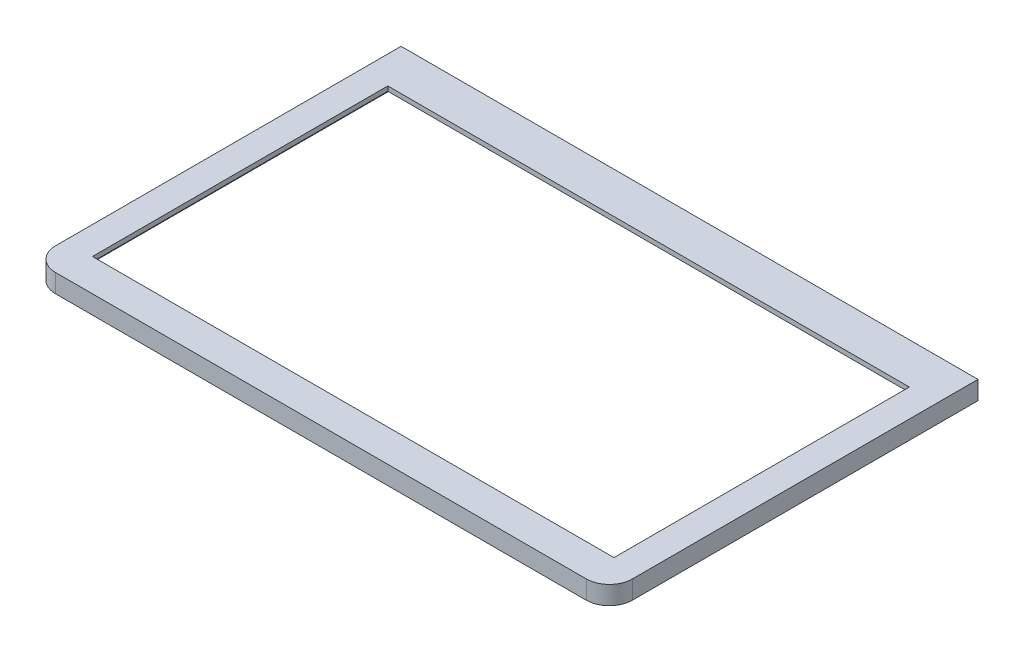
ISO-10303-21;
HEADER;
FILE_DESCRIPTION(('STEP AP214'),'2;1');
FILE_NAME('part.step','',(''),(''),'','','');
FILE_SCHEMA(('AUTOMOTIVE_DESIGN { 1 0 10303 214 1 1 1 1 }'));
ENDSEC;
DATA;
#1=APPLICATION_CONTEXT('core data for automotive mechanical design processes');
#2=APPLICATION_PROTOCOL_DEFINITION('international standard','automotive_design',2000,#1);
#3=PRODUCT_CONTEXT('',#1,'mechanical');
#4=PRODUCT('Part','Part','',(#3));
#5=PRODUCT_RELATED_PRODUCT_CATEGORY('part','',(#4));
#6=PRODUCT_DEFINITION_FORMATION('','',#4);
#7=PRODUCT_DEFINITION_CONTEXT('part definition',#1,'design');
#8=PRODUCT_DEFINITION('design','',#6,#7);
#9=PRODUCT_DEFINITION_SHAPE('','',#8);
#10=(LENGTH_UNIT() NAMED_UNIT(*) SI_UNIT(.MILLI.,.METRE.));
#11=(NAMED_UNIT(*) PLANE_ANGLE_UNIT() SI_UNIT($,.RADIAN.));
#12=(NAMED_UNIT(*) SI_UNIT($,.STERADIAN.) SOLID_ANGLE_UNIT());
#13=UNCERTAINTY_MEASURE_WITH_UNIT(LENGTH_MEASURE(1.E-05),#10,'distance_accuracy_value','');
#14=(GEOMETRIC_REPRESENTATION_CONTEXT(3) GLOBAL_UNCERTAINTY_ASSIGNED_CONTEXT((#13)) GLOBAL_UNIT_ASSIGNED_CONTEXT((#10,
#11,#12)) REPRESENTATION_CONTEXT('',''));
#15=CARTESIAN_POINT('',(0.,0.,0.));
#16=DIRECTION('',(0.,0.,1.));
#17=DIRECTION('',(1.,0.,0.));
#18=AXIS2_PLACEMENT_3D('',#15,#16,#17);
#19=CARTESIAN_POINT('',(0.,8.,0.));
#20=DIRECTION('',(0.,1.,0.));
#21=DIRECTION('',(0.,0.,1.));
#22=AXIS2_PLACEMENT_3D('',#19,#20,#21);
#23=PLANE('',#22);
#24=DIRECTION('',(1.,0.,0.));
#25=VECTOR('',#24,1.);
#26=CARTESIAN_POINT('',(-87.3406720741599,8.,78.8980301274625));
#27=LINE('',#26,#25);
#28=CARTESIAN_POINT('',(-87.3406720741599,8.,78.8980301274625));
#29=VERTEX_POINT('',#28);
#30=CARTESIAN_POINT('',(138.65932792584,8.,78.8980301274625));
#31=VERTEX_POINT('',#30);
#32=EDGE_CURVE('E209',#29,#31,#27,.T.);
#33=ORIENTED_EDGE('',*,*,#32,.F.);
#34=DIRECTION('',(0.,0.,1.));
#35=VECTOR('',#34,1.);
#36=CARTESIAN_POINT('',(-87.3406720741599,8.,-49.1019698725375));
#37=LINE('',#36,#35);
#38=CARTESIAN_POINT('',(-87.3406720741599,8.,-49.1019698725375));
#39=VERTEX_POINT('',#38);
#40=EDGE_CURVE('E212',#39,#29,#37,.T.);
#41=ORIENTED_EDGE('',*,*,#40,.F.);
#42=DIRECTION('',(-1.,0.,0.));
#43=VECTOR('',#42,1.);
#44=CARTESIAN_POINT('',(-87.3406720741599,8.,-49.1019698725375));
#45=LINE('',#44,#43);
#46=CARTESIAN_POINT('',(138.65932792584,8.,-49.1019698725375));
#47=VERTEX_POINT('',#46);
#48=EDGE_CURVE('E202',#47,#39,#45,.T.);
#49=ORIENTED_EDGE('',*,*,#48,.F.);
#50=DIRECTION('',(0.,0.,-1.));
#51=VECTOR('',#50,1.);
#52=CARTESIAN_POINT('',(138.65932792584,8.,-49.1019698725375));
#53=LINE('',#52,#51);
#54=EDGE_CURVE('E205',#31,#47,#53,.T.);
#55=ORIENTED_EDGE('',*,*,#54,.F.);
#56=EDGE_LOOP('',(#33,#41,#49,#55));
#57=FACE_BOUND('',#56,.T.);
#58=CARTESIAN_POINT('',(140.65932792584,8.,82.8980301274625));
#59=DIRECTION('',(0.,-1.,0.));
#60=DIRECTION('',(0.,0.,-1.));
#61=AXIS2_PLACEMENT_3D('',#58,#59,#60);
#62=CIRCLE('',#61,10.);
#63=CARTESIAN_POINT('',(150.65932792584,8.,82.8980301274624));
#64=VERTEX_POINT('',#63);
#65=CARTESIAN_POINT('',(140.65932792584,8.,92.8980301274625));
#66=VERTEX_POINT('',#65);
#67=EDGE_CURVE('E139',#64,#66,#62,.T.);
#68=ORIENTED_EDGE('',*,*,#67,.F.);
#69=DIRECTION('',(0.,0.,-1.));
#70=VECTOR('',#69,1.);
#71=CARTESIAN_POINT('',(150.65932792584,8.,-63.1019698725375));
#72=LINE('',#71,#70);
#73=CARTESIAN_POINT('',(150.65932792584,8.,-66.8519698725375));
#74=VERTEX_POINT('',#73);
#75=EDGE_CURVE('E149',#64,#74,#72,.T.);
#76=ORIENTED_EDGE('',*,*,#75,.T.);
#77=DIRECTION('',(1.,0.,0.));
#78=VECTOR('',#77,1.);
#79=CARTESIAN_POINT('',(150.65932792584,8.,-66.8519698725375));
#80=LINE('',#79,#78);
#81=CARTESIAN_POINT('',(-99.3406720741599,8.,-66.8519698725375));
#82=VERTEX_POINT('',#81);
#83=EDGE_CURVE('E257',#82,#74,#80,.T.);
#84=ORIENTED_EDGE('',*,*,#83,.F.);
#85=DIRECTION('',(0.,0.,1.));
#86=VECTOR('',#85,1.);
#87=CARTESIAN_POINT('',(-99.3406720741599,8.,-63.1019698725375));
#88=LINE('',#87,#86);
#89=CARTESIAN_POINT('',(-99.3406720741599,8.,82.8980301274624));
#90=VERTEX_POINT('',#89);
#91=EDGE_CURVE('E168',#82,#90,#88,.T.);
#92=ORIENTED_EDGE('',*,*,#91,.T.);
#93=CARTESIAN_POINT('',(-89.3406720741599,8.,82.8980301274625));
#94=DIRECTION('',(0.,-1.,0.));
#95=DIRECTION('',(0.,0.,-1.));
#96=AXIS2_PLACEMENT_3D('',#93,#94,#95);
#97=CIRCLE('',#96,9.99999999999999);
#98=CARTESIAN_POINT('',(-89.3406720741599,8.,92.8980301274625));
#99=VERTEX_POINT('',#98);
#100=EDGE_CURVE('E291',#99,#90,#97,.T.);
#101=ORIENTED_EDGE('',*,*,#100,.F.);
#102=DIRECTION('',(1.,0.,0.));
#103=VECTOR('',#102,1.);
#104=CARTESIAN_POINT('',(-99.3406720741599,8.,92.8980301274625));
#105=LINE('',#104,#103);
#106=EDGE_CURVE('E153',#99,#66,#105,.T.);
#107=ORIENTED_EDGE('',*,*,#106,.T.);
#108=EDGE_LOOP('',(#68,#76,#84,#92,#101,#107));
#109=FACE_BOUND('',#108,.T.);
#110=ADVANCED_FACE('F39',(#57,#109),#23,.T.);
#111=CARTESIAN_POINT('',(0.,0.,0.));
#112=DIRECTION('',(0.,1.,0.));
#113=DIRECTION('',(0.,0.,1.));
#114=AXIS2_PLACEMENT_3D('',#111,#112,#113);
#115=PLANE('',#114);
#116=DIRECTION('',(1.,0.,0.));
#117=VECTOR('',#116,1.);
#118=CARTESIAN_POINT('',(-93.0906720741599,0.,-56.8519698725375));
#119=LINE('',#118,#117);
#120=CARTESIAN_POINT('',(-93.0906720741599,0.,-56.8519698725375));
#121=VERTEX_POINT('',#120);
#122=CARTESIAN_POINT('',(142.40932792584,0.,-56.8519698725375));
#123=VERTEX_POINT('',#122);
#124=EDGE_CURVE('E250',#121,#123,#119,.T.);
#125=ORIENTED_EDGE('',*,*,#124,.F.);
#126=DIRECTION('',(0.,0.,-1.));
#127=VECTOR('',#126,1.);
#128=CARTESIAN_POINT('',(-93.0906720741599,0.,82.6480301274625));
#129=LINE('',#128,#127);
#130=CARTESIAN_POINT('',(-93.0906720741599,0.,82.6480301274625));
#131=VERTEX_POINT('',#130);
#132=EDGE_CURVE('E254',#131,#121,#129,.T.);
#133=ORIENTED_EDGE('',*,*,#132,.F.);
#134=DIRECTION('',(-1.,0.,0.));
#135=VECTOR('',#134,1.);
#136=CARTESIAN_POINT('',(-93.0906720741599,0.,82.6480301274625));
#137=LINE('',#136,#135);
#138=CARTESIAN_POINT('',(142.40932792584,0.,82.6480301274625));
#139=VERTEX_POINT('',#138);
#140=EDGE_CURVE('E241',#139,#131,#137,.T.);
#141=ORIENTED_EDGE('',*,*,#140,.F.);
#142=DIRECTION('',(0.,0.,1.));
#143=VECTOR('',#142,1.);
#144=CARTESIAN_POINT('',(142.40932792584,0.,82.6480301274625));
#145=LINE('',#144,#143);
#146=EDGE_CURVE('E246',#123,#139,#145,.T.);
#147=ORIENTED_EDGE('',*,*,#146,.F.);
#148=EDGE_LOOP('',(#125,#133,#141,#147));
#149=FACE_BOUND('',#148,.T.);
#150=DIRECTION('',(0.,0.,-1.));
#151=VECTOR('',#150,1.);
#152=CARTESIAN_POINT('',(150.65932792584,0.,-63.1019698725375));
#153=LINE('',#152,#151);
#154=CARTESIAN_POINT('',(150.65932792584,0.,82.8980301274625));
#155=VERTEX_POINT('',#154);
#156=CARTESIAN_POINT('',(150.65932792584,0.,-66.8519698725375));
#157=VERTEX_POINT('',#156);
#158=EDGE_CURVE('E181',#155,#157,#153,.T.);
#159=ORIENTED_EDGE('',*,*,#158,.F.);
#160=CARTESIAN_POINT('',(140.65932792584,0.,82.8980301274625));
#161=DIRECTION('',(0.,1.,0.));
#162=DIRECTION('',(0.,0.,1.));
#163=AXIS2_PLACEMENT_3D('',#160,#161,#162);
#164=CIRCLE('',#163,10.);
#165=CARTESIAN_POINT('',(140.65932792584,0.,92.8980301274625));
#166=VERTEX_POINT('',#165);
#167=EDGE_CURVE('E62',#155,#166,#164,.F.);
#168=ORIENTED_EDGE('',*,*,#167,.T.);
#169=DIRECTION('',(1.,0.,0.));
#170=VECTOR('',#169,1.);
#171=CARTESIAN_POINT('',(-99.3406720741599,0.,92.8980301274625));
#172=LINE('',#171,#170);
#173=CARTESIAN_POINT('',(-89.3406720741599,0.,92.8980301274625));
#174=VERTEX_POINT('',#173);
#175=EDGE_CURVE('E176',#174,#166,#172,.T.);
#176=ORIENTED_EDGE('',*,*,#175,.F.);
#177=CARTESIAN_POINT('',(-89.3406720741599,0.,82.8980301274625));
#178=DIRECTION('',(0.,1.,0.));
#179=DIRECTION('',(0.,0.,1.));
#180=AXIS2_PLACEMENT_3D('',#177,#178,#179);
#181=CIRCLE('',#180,9.99999999999999);
#182=CARTESIAN_POINT('',(-99.3406720741599,0.,82.8980301274624));
#183=VERTEX_POINT('',#182);
#184=EDGE_CURVE('E55',#174,#183,#181,.F.);
#185=ORIENTED_EDGE('',*,*,#184,.T.);
#186=DIRECTION('',(0.,0.,1.));
#187=VECTOR('',#186,1.);
#188=CARTESIAN_POINT('',(-99.3406720741599,0.,-63.1019698725375));
#189=LINE('',#188,#187);
#190=CARTESIAN_POINT('',(-99.3406720741599,0.,-66.8519698725375));
#191=VERTEX_POINT('',#190);
#192=EDGE_CURVE('E172',#191,#183,#189,.T.);
#193=ORIENTED_EDGE('',*,*,#192,.F.);
#194=DIRECTION('',(-1.,0.,0.));
#195=VECTOR('',#194,1.);
#196=CARTESIAN_POINT('',(150.65932792584,0.,-66.8519698725375));
#197=LINE('',#196,#195);
#198=EDGE_CURVE('E278',#157,#191,#197,.T.);
#199=ORIENTED_EDGE('',*,*,#198,.F.);
#200=EDGE_LOOP('',(#159,#168,#176,#185,#193,#199));
#201=FACE_BOUND('',#200,.T.);
#202=ADVANCED_FACE('F299',(#149,#201),#115,.F.);
#203=CARTESIAN_POINT('',(-99.3406720741599,8.,-63.1019698725375));
#204=DIRECTION('',(1.,0.,0.));
#205=DIRECTION('',(0.,0.,-1.));
#206=AXIS2_PLACEMENT_3D('',#203,#204,#205);
#207=PLANE('',#206);
#208=DIRECTION('',(0.,1.,0.));
#209=VECTOR('',#208,1.);
#210=CARTESIAN_POINT('',(-99.3406720741599,-2.,82.8980301274624));
#211=LINE('',#210,#209);
#212=EDGE_CURVE('E156',#183,#90,#211,.T.);
#213=ORIENTED_EDGE('',*,*,#212,.T.);
#214=ORIENTED_EDGE('',*,*,#91,.F.);
#215=DIRECTION('',(0.,1.,0.));
#216=VECTOR('',#215,1.);
#217=CARTESIAN_POINT('',(-99.3406720741599,8.,-66.8519698725375));
#218=LINE('',#217,#216);
#219=EDGE_CURVE('E274',#191,#82,#218,.T.);
#220=ORIENTED_EDGE('',*,*,#219,.F.);
#221=ORIENTED_EDGE('',*,*,#192,.T.);
#222=EDGE_LOOP('',(#213,#214,#220,#221));
#223=FACE_BOUND('',#222,.T.);
#224=ADVANCED_FACE('F41',(#223),#207,.F.);
#225=CARTESIAN_POINT('',(-99.3406720741599,8.,92.8980301274625));
#226=DIRECTION('',(0.,0.,-1.));
#227=DIRECTION('',(-1.,0.,0.));
#228=AXIS2_PLACEMENT_3D('',#225,#226,#227);
#229=PLANE('',#228);
#230=DIRECTION('',(0.,1.,0.));
#231=VECTOR('',#230,1.);
#232=CARTESIAN_POINT('',(140.65932792584,-2.,92.8980301274625));
#233=LINE('',#232,#231);
#234=EDGE_CURVE('E155',#166,#66,#233,.T.);
#235=ORIENTED_EDGE('',*,*,#234,.T.);
#236=ORIENTED_EDGE('',*,*,#106,.F.);
#237=DIRECTION('',(0.,1.,0.));
#238=VECTOR('',#237,1.);
#239=CARTESIAN_POINT('',(-89.3406720741599,-2.,92.8980301274625));
#240=LINE('',#239,#238);
#241=EDGE_CURVE('E11',#99,#174,#240,.F.);
#242=ORIENTED_EDGE('',*,*,#241,.T.);
#243=ORIENTED_EDGE('',*,*,#175,.T.);
#244=EDGE_LOOP('',(#235,#236,#242,#243));
#245=FACE_BOUND('',#244,.T.);
#246=ADVANCED_FACE('F296',(#245),#229,.F.);
#247=CARTESIAN_POINT('',(-87.3406720741599,8.,-49.1019698725375));
#248=DIRECTION('',(1.,0.,0.));
#249=DIRECTION('',(0.,0.,-1.));
#250=AXIS2_PLACEMENT_3D('',#247,#248,#249);
#251=PLANE('',#250);
#252=DIRECTION('',(0.,-1.,0.));
#253=VECTOR('',#252,1.);
#254=CARTESIAN_POINT('',(-87.3406720741599,8.,78.8980301274625));
#255=LINE('',#254,#253);
#256=CARTESIAN_POINT('',(-87.3406720741599,6.,78.8980301274625));
#257=VERTEX_POINT('',#256);
#258=EDGE_CURVE('E177',#29,#257,#255,.T.);
#259=ORIENTED_EDGE('',*,*,#258,.T.);
#260=DIRECTION('',(0.,0.,-1.));
#261=VECTOR('',#260,1.);
#262=CARTESIAN_POINT('',(-87.3406720741599,6.,-49.1019698725375));
#263=LINE('',#262,#261);
#264=CARTESIAN_POINT('',(-87.3406720741599,6.,-49.1019698725375));
#265=VERTEX_POINT('',#264);
#266=EDGE_CURVE('E215',#257,#265,#263,.T.);
#267=ORIENTED_EDGE('',*,*,#266,.T.);
#268=DIRECTION('',(0.,-1.,0.));
#269=VECTOR('',#268,1.);
#270=CARTESIAN_POINT('',(-87.3406720741599,8.,-49.1019698725375));
#271=LINE('',#270,#269);
#272=EDGE_CURVE('E198',#39,#265,#271,.T.);
#273=ORIENTED_EDGE('',*,*,#272,.F.);
#274=ORIENTED_EDGE('',*,*,#40,.T.);
#275=EDGE_LOOP('',(#259,#267,#273,#274));
#276=FACE_BOUND('',#275,.T.);
#277=ADVANCED_FACE('F322',(#276),#251,.T.);
#278=CARTESIAN_POINT('',(-87.3406720741599,8.,78.8980301274625));
#279=DIRECTION('',(0.,0.,-1.));
#280=DIRECTION('',(-1.,0.,0.));
#281=AXIS2_PLACEMENT_3D('',#278,#279,#280);
#282=PLANE('',#281);
#283=DIRECTION('',(0.,-1.,0.));
#284=VECTOR('',#283,1.);
#285=CARTESIAN_POINT('',(138.65932792584,8.,78.8980301274625));
#286=LINE('',#285,#284);
#287=CARTESIAN_POINT('',(138.65932792584,6.,78.8980301274625));
#288=VERTEX_POINT('',#287);
#289=EDGE_CURVE('E190',#31,#288,#286,.T.);
#290=ORIENTED_EDGE('',*,*,#289,.T.);
#291=DIRECTION('',(-1.,0.,0.));
#292=VECTOR('',#291,1.);
#293=CARTESIAN_POINT('',(-87.3406720741599,6.,78.8980301274625));
#294=LINE('',#293,#292);
#295=EDGE_CURVE('E219',#288,#257,#294,.T.);
#296=ORIENTED_EDGE('',*,*,#295,.T.);
#297=ORIENTED_EDGE('',*,*,#258,.F.);
#298=ORIENTED_EDGE('',*,*,#32,.T.);
#299=EDGE_LOOP('',(#290,#296,#297,#298));
#300=FACE_BOUND('',#299,.T.);
#301=ADVANCED_FACE('F333',(#300),#282,.T.);
#302=CARTESIAN_POINT('',(138.65932792584,8.,-49.1019698725375));
#303=DIRECTION('',(-1.,0.,0.));
#304=DIRECTION('',(0.,0.,1.));
#305=AXIS2_PLACEMENT_3D('',#302,#303,#304);
#306=PLANE('',#305);
#307=DIRECTION('',(0.,-1.,0.));
#308=VECTOR('',#307,1.);
#309=CARTESIAN_POINT('',(138.65932792584,8.,-49.1019698725375));
#310=LINE('',#309,#308);
#311=CARTESIAN_POINT('',(138.65932792584,6.,-49.1019698725375));
#312=VERTEX_POINT('',#311);
#313=EDGE_CURVE('E194',#47,#312,#310,.T.);
#314=ORIENTED_EDGE('',*,*,#313,.T.);
#315=DIRECTION('',(0.,0.,1.));
#316=VECTOR('',#315,1.);
#317=CARTESIAN_POINT('',(138.65932792584,6.,-49.1019698725375));
#318=LINE('',#317,#316);
#319=EDGE_CURVE('E223',#312,#288,#318,.T.);
#320=ORIENTED_EDGE('',*,*,#319,.T.);
#321=ORIENTED_EDGE('',*,*,#289,.F.);
#322=ORIENTED_EDGE('',*,*,#54,.T.);
#323=EDGE_LOOP('',(#314,#320,#321,#322));
#324=FACE_BOUND('',#323,.T.);
#325=ADVANCED_FACE('F416',(#324),#306,.T.);
#326=CARTESIAN_POINT('',(-87.3406720741599,8.,-49.1019698725375));
#327=DIRECTION('',(0.,0.,1.));
#328=DIRECTION('',(1.,0.,0.));
#329=AXIS2_PLACEMENT_3D('',#326,#327,#328);
#330=PLANE('',#329);
#331=ORIENTED_EDGE('',*,*,#272,.T.);
#332=DIRECTION('',(1.,0.,0.));
#333=VECTOR('',#332,1.);
#334=CARTESIAN_POINT('',(-87.3406720741599,6.,-49.1019698725375));
#335=LINE('',#334,#333);
#336=EDGE_CURVE('E145',#265,#312,#335,.T.);
#337=ORIENTED_EDGE('',*,*,#336,.T.);
#338=ORIENTED_EDGE('',*,*,#313,.F.);
#339=ORIENTED_EDGE('',*,*,#48,.T.);
#340=EDGE_LOOP('',(#331,#337,#338,#339));
#341=FACE_BOUND('',#340,.T.);
#342=ADVANCED_FACE('F327',(#341),#330,.T.);
#343=CARTESIAN_POINT('',(150.65932792584,8.,-63.1019698725375));
#344=DIRECTION('',(-1.,0.,0.));
#345=DIRECTION('',(0.,0.,1.));
#346=AXIS2_PLACEMENT_3D('',#343,#344,#345);
#347=PLANE('',#346);
#348=ORIENTED_EDGE('',*,*,#75,.F.);
#349=DIRECTION('',(0.,1.,0.));
#350=VECTOR('',#349,1.);
#351=CARTESIAN_POINT('',(150.65932792584,-2.,82.8980301274625));
#352=LINE('',#351,#350);
#353=EDGE_CURVE('E48',#64,#155,#352,.F.);
#354=ORIENTED_EDGE('',*,*,#353,.T.);
#355=ORIENTED_EDGE('',*,*,#158,.T.);
#356=DIRECTION('',(0.,-1.,0.));
#357=VECTOR('',#356,1.);
#358=CARTESIAN_POINT('',(150.65932792584,8.,-66.8519698725375));
#359=LINE('',#358,#357);
#360=EDGE_CURVE('E161',#74,#157,#359,.T.);
#361=ORIENTED_EDGE('',*,*,#360,.F.);
#362=EDGE_LOOP('',(#348,#354,#355,#361));
#363=FACE_BOUND('',#362,.T.);
#364=ADVANCED_FACE('F159',(#363),#347,.F.);
#365=CARTESIAN_POINT('',(-93.0906720741599,6.,82.6480301274625));
#366=DIRECTION('',(-1.,0.,0.));
#367=DIRECTION('',(0.,0.,1.));
#368=AXIS2_PLACEMENT_3D('',#365,#366,#367);
#369=PLANE('',#368);
#370=ORIENTED_EDGE('',*,*,#132,.T.);
#371=DIRECTION('',(0.,-1.,0.));
#372=VECTOR('',#371,1.);
#373=CARTESIAN_POINT('',(-93.0906720741599,6.,-56.8519698725375));
#374=LINE('',#373,#372);
#375=CARTESIAN_POINT('',(-93.0906720741599,6.,-56.8519698725375));
#376=VERTEX_POINT('',#375);
#377=EDGE_CURVE('E228',#376,#121,#374,.T.);
#378=ORIENTED_EDGE('',*,*,#377,.F.);
#379=DIRECTION('',(0.,0.,-1.));
#380=VECTOR('',#379,1.);
#381=CARTESIAN_POINT('',(-93.0906720741599,6.,82.6480301274625));
#382=LINE('',#381,#380);
#383=CARTESIAN_POINT('',(-93.0906720741599,6.,82.6480301274625));
#384=VERTEX_POINT('',#383);
#385=EDGE_CURVE('E245',#384,#376,#382,.T.);
#386=ORIENTED_EDGE('',*,*,#385,.F.);
#387=DIRECTION('',(0.,-1.,0.));
#388=VECTOR('',#387,1.);
#389=CARTESIAN_POINT('',(-93.0906720741599,6.,82.6480301274625));
#390=LINE('',#389,#388);
#391=EDGE_CURVE('E227',#384,#131,#390,.T.);
#392=ORIENTED_EDGE('',*,*,#391,.T.);
#393=EDGE_LOOP('',(#370,#378,#386,#392));
#394=FACE_BOUND('',#393,.T.);
#395=ADVANCED_FACE('F326',(#394),#369,.F.);
#396=CARTESIAN_POINT('',(-93.0906720741599,6.,82.6480301274625));
#397=DIRECTION('',(0.,0.,1.));
#398=DIRECTION('',(1.,0.,0.));
#399=AXIS2_PLACEMENT_3D('',#396,#397,#398);
#400=PLANE('',#399);
#401=ORIENTED_EDGE('',*,*,#140,.T.);
#402=ORIENTED_EDGE('',*,*,#391,.F.);
#403=DIRECTION('',(-1.,0.,0.));
#404=VECTOR('',#403,1.);
#405=CARTESIAN_POINT('',(-93.0906720741599,6.,82.6480301274625));
#406=LINE('',#405,#404);
#407=CARTESIAN_POINT('',(142.40932792584,6.,82.6480301274625));
#408=VERTEX_POINT('',#407);
#409=EDGE_CURVE('E233',#408,#384,#406,.T.);
#410=ORIENTED_EDGE('',*,*,#409,.F.);
#411=DIRECTION('',(0.,-1.,0.));
#412=VECTOR('',#411,1.);
#413=CARTESIAN_POINT('',(142.40932792584,6.,82.6480301274625));
#414=LINE('',#413,#412);
#415=EDGE_CURVE('E236',#408,#139,#414,.T.);
#416=ORIENTED_EDGE('',*,*,#415,.T.);
#417=EDGE_LOOP('',(#401,#402,#410,#416));
#418=FACE_BOUND('',#417,.T.);
#419=ADVANCED_FACE('F387',(#418),#400,.F.);
#420=CARTESIAN_POINT('',(142.40932792584,6.,82.6480301274625));
#421=DIRECTION('',(1.,0.,0.));
#422=DIRECTION('',(0.,0.,-1.));
#423=AXIS2_PLACEMENT_3D('',#420,#421,#422);
#424=PLANE('',#423);
#425=ORIENTED_EDGE('',*,*,#146,.T.);
#426=ORIENTED_EDGE('',*,*,#415,.F.);
#427=DIRECTION('',(0.,0.,1.));
#428=VECTOR('',#427,1.);
#429=CARTESIAN_POINT('',(142.40932792584,6.,82.6480301274625));
#430=LINE('',#429,#428);
#431=CARTESIAN_POINT('',(142.40932792584,6.,-56.8519698725375));
#432=VERTEX_POINT('',#431);
#433=EDGE_CURVE('E261',#432,#408,#430,.T.);
#434=ORIENTED_EDGE('',*,*,#433,.F.);
#435=DIRECTION('',(0.,-1.,0.));
#436=VECTOR('',#435,1.);
#437=CARTESIAN_POINT('',(142.40932792584,6.,-56.8519698725375));
#438=LINE('',#437,#436);
#439=EDGE_CURVE('E232',#432,#123,#438,.T.);
#440=ORIENTED_EDGE('',*,*,#439,.T.);
#441=EDGE_LOOP('',(#425,#426,#434,#440));
#442=FACE_BOUND('',#441,.T.);
#443=ADVANCED_FACE('F377',(#442),#424,.F.);
#444=CARTESIAN_POINT('',(-93.0906720741599,6.,-56.8519698725375));
#445=DIRECTION('',(0.,0.,-1.));
#446=DIRECTION('',(-1.,0.,0.));
#447=AXIS2_PLACEMENT_3D('',#444,#445,#446);
#448=PLANE('',#447);
#449=ORIENTED_EDGE('',*,*,#124,.T.);
#450=ORIENTED_EDGE('',*,*,#439,.F.);
#451=DIRECTION('',(1.,0.,0.));
#452=VECTOR('',#451,1.);
#453=CARTESIAN_POINT('',(-93.0906720741599,6.,-56.8519698725375));
#454=LINE('',#453,#452);
#455=EDGE_CURVE('E265',#376,#432,#454,.T.);
#456=ORIENTED_EDGE('',*,*,#455,.F.);
#457=ORIENTED_EDGE('',*,*,#377,.T.);
#458=EDGE_LOOP('',(#449,#450,#456,#457));
#459=FACE_BOUND('',#458,.T.);
#460=ADVANCED_FACE('F367',(#459),#448,.F.);
#461=CARTESIAN_POINT('',(0.,6.,0.));
#462=DIRECTION('',(0.,-1.,0.));
#463=DIRECTION('',(0.,0.,-1.));
#464=AXIS2_PLACEMENT_3D('',#461,#462,#463);
#465=PLANE('',#464);
#466=ORIENTED_EDGE('',*,*,#295,.F.);
#467=ORIENTED_EDGE('',*,*,#319,.F.);
#468=ORIENTED_EDGE('',*,*,#336,.F.);
#469=ORIENTED_EDGE('',*,*,#266,.F.);
#470=EDGE_LOOP('',(#466,#467,#468,#469));
#471=FACE_BOUND('',#470,.T.);
#472=ORIENTED_EDGE('',*,*,#385,.T.);
#473=ORIENTED_EDGE('',*,*,#455,.T.);
#474=ORIENTED_EDGE('',*,*,#433,.T.);
#475=ORIENTED_EDGE('',*,*,#409,.T.);
#476=EDGE_LOOP('',(#472,#473,#474,#475));
#477=FACE_BOUND('',#476,.T.);
#478=ADVANCED_FACE('F357',(#471,#477),#465,.T.);
#479=CARTESIAN_POINT('',(0.,0.,-66.8519698725375));
#480=DIRECTION('',(0.,0.,-1.));
#481=DIRECTION('',(-1.,0.,0.));
#482=AXIS2_PLACEMENT_3D('',#479,#480,#481);
#483=PLANE('',#482);
#484=ORIENTED_EDGE('',*,*,#360,.T.);
#485=ORIENTED_EDGE('',*,*,#198,.T.);
#486=ORIENTED_EDGE('',*,*,#219,.T.);
#487=ORIENTED_EDGE('',*,*,#83,.T.);
#488=EDGE_LOOP('',(#484,#485,#486,#487));
#489=FACE_BOUND('',#488,.T.);
#490=ADVANCED_FACE('F302',(#489),#483,.T.);
#491=CARTESIAN_POINT('',(140.65932792584,-2.,82.8980301274625));
#492=DIRECTION('',(0.,1.,0.));
#493=DIRECTION('',(0.,0.,1.));
#494=AXIS2_PLACEMENT_3D('',#491,#492,#493);
#495=CYLINDRICAL_SURFACE('',#494,10.);
#496=ORIENTED_EDGE('',*,*,#353,.F.);
#497=ORIENTED_EDGE('',*,*,#67,.T.);
#498=ORIENTED_EDGE('',*,*,#234,.F.);
#499=ORIENTED_EDGE('',*,*,#167,.F.);
#500=EDGE_LOOP('',(#496,#497,#498,#499));
#501=FACE_BOUND('',#500,.T.);
#502=ADVANCED_FACE('F138',(#501),#495,.T.);
#503=CARTESIAN_POINT('',(-89.3406720741599,-2.,82.8980301274625));
#504=DIRECTION('',(0.,1.,0.));
#505=DIRECTION('',(0.,0.,1.));
#506=AXIS2_PLACEMENT_3D('',#503,#504,#505);
#507=CYLINDRICAL_SURFACE('',#506,9.99999999999999);
#508=ORIENTED_EDGE('',*,*,#241,.F.);
#509=ORIENTED_EDGE('',*,*,#100,.T.);
#510=ORIENTED_EDGE('',*,*,#212,.F.);
#511=ORIENTED_EDGE('',*,*,#184,.F.);
#512=EDGE_LOOP('',(#508,#509,#510,#511));
#513=FACE_BOUND('',#512,.T.);
#514=ADVANCED_FACE('F304',(#513),#507,.T.);
#515=CLOSED_SHELL('',(#110,#202,#224,#246,#277,#301,#325,#342,#364,#395,#419,#443,#460,#478,
#490,#502,#514));
#516=MANIFOLD_SOLID_BREP('B2',#515);
#517=ADVANCED_BREP_SHAPE_REPRESENTATION('',(#18,#516),#14);
#518=SHAPE_DEFINITION_REPRESENTATION(#9,#517);
ENDSEC;
END-ISO-10303-21;
